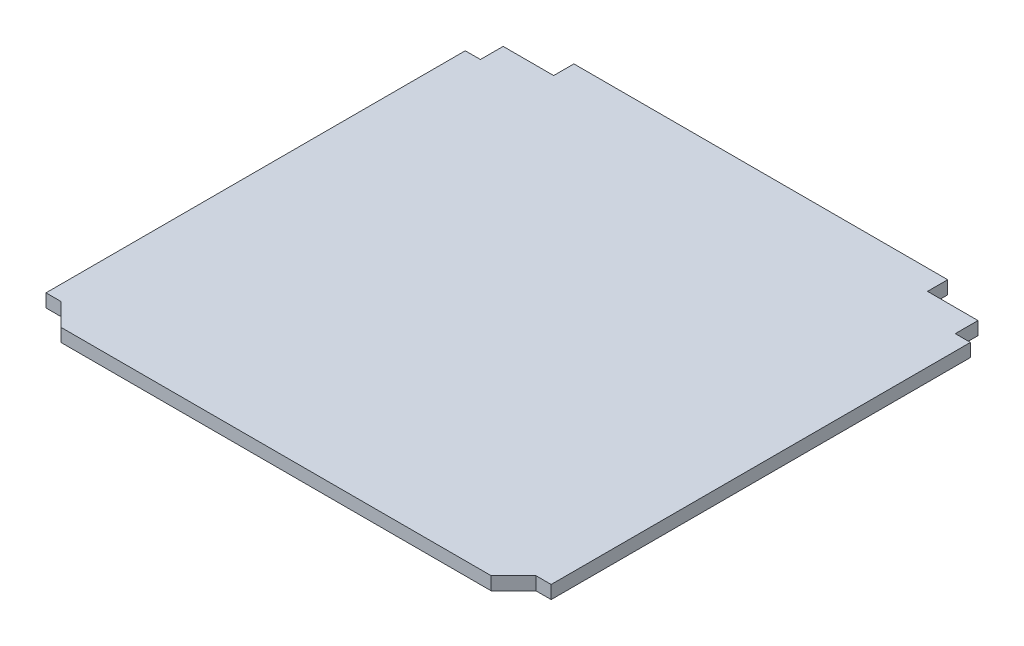
ISO-10303-21;
HEADER;
FILE_DESCRIPTION(('STEP AP214'),'2;1');
FILE_NAME('part.step','',(''),(''),'','','');
FILE_SCHEMA(('AUTOMOTIVE_DESIGN { 1 0 10303 214 1 1 1 1 }'));
ENDSEC;
DATA;
#1=APPLICATION_CONTEXT('core data for automotive mechanical design processes');
#2=APPLICATION_PROTOCOL_DEFINITION('international standard','automotive_design',2000,#1);
#3=PRODUCT_CONTEXT('',#1,'mechanical');
#4=PRODUCT('Part','Part','',(#3));
#5=PRODUCT_RELATED_PRODUCT_CATEGORY('part','',(#4));
#6=PRODUCT_DEFINITION_FORMATION('','',#4);
#7=PRODUCT_DEFINITION_CONTEXT('part definition',#1,'design');
#8=PRODUCT_DEFINITION('design','',#6,#7);
#9=PRODUCT_DEFINITION_SHAPE('','',#8);
#10=(LENGTH_UNIT() NAMED_UNIT(*) SI_UNIT(.MILLI.,.METRE.));
#11=(NAMED_UNIT(*) PLANE_ANGLE_UNIT() SI_UNIT($,.RADIAN.));
#12=(NAMED_UNIT(*) SI_UNIT($,.STERADIAN.) SOLID_ANGLE_UNIT());
#13=UNCERTAINTY_MEASURE_WITH_UNIT(LENGTH_MEASURE(1.E-05),#10,'distance_accuracy_value','');
#14=(GEOMETRIC_REPRESENTATION_CONTEXT(3) GLOBAL_UNCERTAINTY_ASSIGNED_CONTEXT((#13)) GLOBAL_UNIT_ASSIGNED_CONTEXT((#10,
#11,#12)) REPRESENTATION_CONTEXT('',''));
#15=CARTESIAN_POINT('',(0.,0.,0.));
#16=DIRECTION('',(0.,0.,1.));
#17=DIRECTION('',(1.,0.,0.));
#18=AXIS2_PLACEMENT_3D('',#15,#16,#17);
#19=CARTESIAN_POINT('',(32.8391686311288,2.6,37.));
#20=DIRECTION('',(0.,1.,0.));
#21=DIRECTION('',(-1.,0.,0.));
#22=AXIS2_PLACEMENT_3D('',#19,#20,#21);
#23=PLANE('',#22);
#24=DIRECTION('',(-0.707106781186536,0.,-0.707106781186559));
#25=VECTOR('',#24,1.);
#26=CARTESIAN_POINT('',(-44.2500000000006,2.59999999999996,44.2499999999993));
#27=LINE('',#26,#25);
#28=CARTESIAN_POINT('',(-42.5688680687594,2.59999999999998,45.9311319312405));
#29=VERTEX_POINT('',#28);
#30=CARTESIAN_POINT('',(-46.9999999999998,2.59999999999998,41.5));
#31=VERTEX_POINT('',#30);
#32=EDGE_CURVE('E43',#29,#31,#27,.T.);
#33=ORIENTED_EDGE('',*,*,#32,.F.);
#34=DIRECTION('',(1.,0.,0.));
#35=VECTOR('',#34,1.);
#36=CARTESIAN_POINT('',(0.,2.59999999999999,45.9311319312405));
#37=LINE('',#36,#35);
#38=CARTESIAN_POINT('',(42.5688680687594,2.59999999999999,45.9311319312405));
#39=VERTEX_POINT('',#38);
#40=EDGE_CURVE('E218',#29,#39,#37,.T.);
#41=ORIENTED_EDGE('',*,*,#40,.T.);
#42=DIRECTION('',(0.707106781186536,0.,-0.707106781186559));
#43=VECTOR('',#42,1.);
#44=CARTESIAN_POINT('',(44.2500000000007,2.59999999999999,44.2499999999992));
#45=LINE('',#44,#43);
#46=CARTESIAN_POINT('',(46.9999999999998,2.6,41.5));
#47=VERTEX_POINT('',#46);
#48=EDGE_CURVE('E220',#39,#47,#45,.T.);
#49=ORIENTED_EDGE('',*,*,#48,.T.);
#50=DIRECTION('',(1.,0.,0.));
#51=VECTOR('',#50,1.);
#52=CARTESIAN_POINT('',(0.,2.59999999999999,41.5));
#53=LINE('',#52,#51);
#54=CARTESIAN_POINT('',(49.9999999999998,2.59999999999999,41.5));
#55=VERTEX_POINT('',#54);
#56=EDGE_CURVE('E222',#47,#55,#53,.T.);
#57=ORIENTED_EDGE('',*,*,#56,.T.);
#58=DIRECTION('',(0.,0.,1.));
#59=VECTOR('',#58,1.);
#60=CARTESIAN_POINT('',(49.9999999999998,2.59999999999999,0.));
#61=LINE('',#60,#59);
#62=CARTESIAN_POINT('',(49.9999999999998,2.6,-41.5000000000004));
#63=VERTEX_POINT('',#62);
#64=EDGE_CURVE('E225',#63,#55,#61,.T.);
#65=ORIENTED_EDGE('',*,*,#64,.F.);
#66=DIRECTION('',(1.,0.,0.));
#67=VECTOR('',#66,1.);
#68=CARTESIAN_POINT('',(0.,2.59999999999999,-41.5000000000004));
#69=LINE('',#68,#67);
#70=CARTESIAN_POINT('',(47.0000000000006,2.59999999999999,-41.5000000000004));
#71=VERTEX_POINT('',#70);
#72=EDGE_CURVE('E230',#71,#63,#69,.T.);
#73=ORIENTED_EDGE('',*,*,#72,.F.);
#74=DIRECTION('',(0.,0.,1.));
#75=VECTOR('',#74,1.);
#76=CARTESIAN_POINT('',(47.0000000000006,2.59999999999999,0.));
#77=LINE('',#76,#75);
#78=CARTESIAN_POINT('',(47.0000000000006,2.6,-46.0000000000004));
#79=VERTEX_POINT('',#78);
#80=EDGE_CURVE('E234',#79,#71,#77,.T.);
#81=ORIENTED_EDGE('',*,*,#80,.F.);
#82=DIRECTION('',(1.,0.,0.));
#83=VECTOR('',#82,1.);
#84=CARTESIAN_POINT('',(0.,2.59999999999999,-46.0000000000004));
#85=LINE('',#84,#83);
#86=CARTESIAN_POINT('',(37.0000000000006,2.59999999999999,-46.0000000000004));
#87=VERTEX_POINT('',#86);
#88=EDGE_CURVE('E238',#87,#79,#85,.T.);
#89=ORIENTED_EDGE('',*,*,#88,.F.);
#90=DIRECTION('',(0.,0.,1.));
#91=VECTOR('',#90,1.);
#92=CARTESIAN_POINT('',(37.0000000000006,2.59999999999999,0.));
#93=LINE('',#92,#91);
#94=CARTESIAN_POINT('',(37.0000000000006,2.6,-50.0000000000004));
#95=VERTEX_POINT('',#94);
#96=EDGE_CURVE('E196',#95,#87,#93,.T.);
#97=ORIENTED_EDGE('',*,*,#96,.F.);
#98=DIRECTION('',(-1.,0.,0.));
#99=VECTOR('',#98,1.);
#100=CARTESIAN_POINT('',(0.,2.59999999999999,-50.0000000000004));
#101=LINE('',#100,#99);
#102=CARTESIAN_POINT('',(-37.0000000000006,2.59999999999999,-50.0000000000004));
#103=VERTEX_POINT('',#102);
#104=EDGE_CURVE('E224',#95,#103,#101,.T.);
#105=ORIENTED_EDGE('',*,*,#104,.T.);
#106=DIRECTION('',(0.,0.,1.));
#107=VECTOR('',#106,1.);
#108=CARTESIAN_POINT('',(-37.0000000000006,2.59999999999999,0.));
#109=LINE('',#108,#107);
#110=CARTESIAN_POINT('',(-37.0000000000006,2.59999999999998,-46.0000000000004));
#111=VERTEX_POINT('',#110);
#112=EDGE_CURVE('E245',#103,#111,#109,.T.);
#113=ORIENTED_EDGE('',*,*,#112,.T.);
#114=DIRECTION('',(-1.,0.,0.));
#115=VECTOR('',#114,1.);
#116=CARTESIAN_POINT('',(0.,2.59999999999999,-46.0000000000004));
#117=LINE('',#116,#115);
#118=CARTESIAN_POINT('',(-47.0000000000006,2.59999999999996,-46.0000000000004));
#119=VERTEX_POINT('',#118);
#120=EDGE_CURVE('E247',#111,#119,#117,.T.);
#121=ORIENTED_EDGE('',*,*,#120,.T.);
#122=DIRECTION('',(0.,0.,1.));
#123=VECTOR('',#122,1.);
#124=CARTESIAN_POINT('',(-47.0000000000006,2.59999999999996,0.));
#125=LINE('',#124,#123);
#126=CARTESIAN_POINT('',(-47.0000000000006,2.59999999999998,-41.5000000000004));
#127=VERTEX_POINT('',#126);
#128=EDGE_CURVE('E249',#119,#127,#125,.T.);
#129=ORIENTED_EDGE('',*,*,#128,.T.);
#130=DIRECTION('',(-1.,0.,0.));
#131=VECTOR('',#130,1.);
#132=CARTESIAN_POINT('',(0.,2.59999999999999,-41.5000000000004));
#133=LINE('',#132,#131);
#134=CARTESIAN_POINT('',(-49.9999999999997,2.59999999999996,-41.5000000000004));
#135=VERTEX_POINT('',#134);
#136=EDGE_CURVE('E141',#127,#135,#133,.T.);
#137=ORIENTED_EDGE('',*,*,#136,.T.);
#138=DIRECTION('',(0.,0.,1.));
#139=VECTOR('',#138,1.);
#140=CARTESIAN_POINT('',(-49.9999999999997,2.59999999999996,0.));
#141=LINE('',#140,#139);
#142=CARTESIAN_POINT('',(-49.9999999999997,2.59999999999999,41.5));
#143=VERTEX_POINT('',#142);
#144=EDGE_CURVE('E145',#135,#143,#141,.T.);
#145=ORIENTED_EDGE('',*,*,#144,.T.);
#146=DIRECTION('',(-1.,0.,0.));
#147=VECTOR('',#146,1.);
#148=CARTESIAN_POINT('',(0.,2.59999999999999,41.5));
#149=LINE('',#148,#147);
#150=EDGE_CURVE('E148',#31,#143,#149,.T.);
#151=ORIENTED_EDGE('',*,*,#150,.F.);
#152=EDGE_LOOP('',(#33,#41,#49,#57,#65,#73,#81,#89,#97,#105,#113,#121,#129,#137,#145,#151));
#153=FACE_BOUND('',#152,.T.);
#154=ADVANCED_FACE('F35',(#153),#23,.T.);
#155=CARTESIAN_POINT('',(0.,0.,0.));
#156=DIRECTION('',(0.,1.,0.));
#157=DIRECTION('',(0.,0.,1.));
#158=AXIS2_PLACEMENT_3D('',#155,#156,#157);
#159=PLANE('',#158);
#160=DIRECTION('',(-0.707106781186536,0.,-0.707106781186559));
#161=VECTOR('',#160,1.);
#162=CARTESIAN_POINT('',(-44.2500000000006,0.,44.2499999999992));
#163=LINE('',#162,#161);
#164=CARTESIAN_POINT('',(-42.5688680687594,0.,45.9311319312405));
#165=VERTEX_POINT('',#164);
#166=CARTESIAN_POINT('',(-46.9999999999998,0.,41.5));
#167=VERTEX_POINT('',#166);
#168=EDGE_CURVE('E167',#165,#167,#163,.T.);
#169=ORIENTED_EDGE('',*,*,#168,.T.);
#170=DIRECTION('',(-1.,0.,0.));
#171=VECTOR('',#170,1.);
#172=CARTESIAN_POINT('',(0.,0.,41.5));
#173=LINE('',#172,#171);
#174=CARTESIAN_POINT('',(-49.9999999999997,0.,41.5));
#175=VERTEX_POINT('',#174);
#176=EDGE_CURVE('E162',#167,#175,#173,.T.);
#177=ORIENTED_EDGE('',*,*,#176,.T.);
#178=DIRECTION('',(0.,0.,1.));
#179=VECTOR('',#178,1.);
#180=CARTESIAN_POINT('',(-49.9999999999997,0.,0.));
#181=LINE('',#180,#179);
#182=CARTESIAN_POINT('',(-49.9999999999997,0.,-41.5000000000004));
#183=VERTEX_POINT('',#182);
#184=EDGE_CURVE('E174',#183,#175,#181,.T.);
#185=ORIENTED_EDGE('',*,*,#184,.F.);
#186=DIRECTION('',(-1.,0.,0.));
#187=VECTOR('',#186,1.);
#188=CARTESIAN_POINT('',(0.,0.,-41.5000000000004));
#189=LINE('',#188,#187);
#190=CARTESIAN_POINT('',(-47.0000000000006,0.,-41.5000000000004));
#191=VERTEX_POINT('',#190);
#192=EDGE_CURVE('E178',#191,#183,#189,.T.);
#193=ORIENTED_EDGE('',*,*,#192,.F.);
#194=DIRECTION('',(0.,0.,1.));
#195=VECTOR('',#194,1.);
#196=CARTESIAN_POINT('',(-47.0000000000006,0.,0.));
#197=LINE('',#196,#195);
#198=CARTESIAN_POINT('',(-47.0000000000006,0.,-46.0000000000004));
#199=VERTEX_POINT('',#198);
#200=EDGE_CURVE('E182',#199,#191,#197,.T.);
#201=ORIENTED_EDGE('',*,*,#200,.F.);
#202=DIRECTION('',(-1.,0.,0.));
#203=VECTOR('',#202,1.);
#204=CARTESIAN_POINT('',(0.,0.,-46.0000000000004));
#205=LINE('',#204,#203);
#206=CARTESIAN_POINT('',(-37.0000000000006,0.,-46.0000000000004));
#207=VERTEX_POINT('',#206);
#208=EDGE_CURVE('E186',#207,#199,#205,.T.);
#209=ORIENTED_EDGE('',*,*,#208,.F.);
#210=DIRECTION('',(0.,0.,1.));
#211=VECTOR('',#210,1.);
#212=CARTESIAN_POINT('',(-37.0000000000006,0.,0.));
#213=LINE('',#212,#211);
#214=CARTESIAN_POINT('',(-37.0000000000006,0.,-50.0000000000004));
#215=VERTEX_POINT('',#214);
#216=EDGE_CURVE('E190',#215,#207,#213,.T.);
#217=ORIENTED_EDGE('',*,*,#216,.F.);
#218=DIRECTION('',(-1.,0.,0.));
#219=VECTOR('',#218,1.);
#220=CARTESIAN_POINT('',(0.,0.,-50.0000000000004));
#221=LINE('',#220,#219);
#222=CARTESIAN_POINT('',(37.0000000000006,0.,-50.0000000000004));
#223=VERTEX_POINT('',#222);
#224=EDGE_CURVE('E194',#223,#215,#221,.T.);
#225=ORIENTED_EDGE('',*,*,#224,.F.);
#226=DIRECTION('',(0.,0.,1.));
#227=VECTOR('',#226,1.);
#228=CARTESIAN_POINT('',(37.0000000000006,0.,0.));
#229=LINE('',#228,#227);
#230=CARTESIAN_POINT('',(37.0000000000006,0.,-46.0000000000004));
#231=VERTEX_POINT('',#230);
#232=EDGE_CURVE('E166',#223,#231,#229,.T.);
#233=ORIENTED_EDGE('',*,*,#232,.T.);
#234=DIRECTION('',(1.,0.,0.));
#235=VECTOR('',#234,1.);
#236=CARTESIAN_POINT('',(0.,0.,-46.0000000000004));
#237=LINE('',#236,#235);
#238=CARTESIAN_POINT('',(47.0000000000006,0.,-46.0000000000004));
#239=VERTEX_POINT('',#238);
#240=EDGE_CURVE('E170',#231,#239,#237,.T.);
#241=ORIENTED_EDGE('',*,*,#240,.T.);
#242=DIRECTION('',(0.,0.,1.));
#243=VECTOR('',#242,1.);
#244=CARTESIAN_POINT('',(47.0000000000006,0.,0.));
#245=LINE('',#244,#243);
#246=CARTESIAN_POINT('',(47.0000000000006,0.,-41.5000000000004));
#247=VERTEX_POINT('',#246);
#248=EDGE_CURVE('E200',#239,#247,#245,.T.);
#249=ORIENTED_EDGE('',*,*,#248,.T.);
#250=DIRECTION('',(1.,0.,0.));
#251=VECTOR('',#250,1.);
#252=CARTESIAN_POINT('',(0.,0.,-41.5000000000004));
#253=LINE('',#252,#251);
#254=CARTESIAN_POINT('',(49.9999999999998,0.,-41.5000000000004));
#255=VERTEX_POINT('',#254);
#256=EDGE_CURVE('E203',#247,#255,#253,.T.);
#257=ORIENTED_EDGE('',*,*,#256,.T.);
#258=DIRECTION('',(0.,0.,1.));
#259=VECTOR('',#258,1.);
#260=CARTESIAN_POINT('',(49.9999999999998,0.,0.));
#261=LINE('',#260,#259);
#262=CARTESIAN_POINT('',(49.9999999999998,0.,41.5));
#263=VERTEX_POINT('',#262);
#264=EDGE_CURVE('E152',#255,#263,#261,.T.);
#265=ORIENTED_EDGE('',*,*,#264,.T.);
#266=DIRECTION('',(1.,0.,0.));
#267=VECTOR('',#266,1.);
#268=CARTESIAN_POINT('',(0.,0.,41.5));
#269=LINE('',#268,#267);
#270=CARTESIAN_POINT('',(46.9999999999998,0.,41.5));
#271=VERTEX_POINT('',#270);
#272=EDGE_CURVE('E208',#271,#263,#269,.T.);
#273=ORIENTED_EDGE('',*,*,#272,.F.);
#274=DIRECTION('',(0.707106781186536,0.,-0.707106781186559));
#275=VECTOR('',#274,1.);
#276=CARTESIAN_POINT('',(44.2500000000006,0.,44.2499999999992));
#277=LINE('',#276,#275);
#278=CARTESIAN_POINT('',(42.5688680687594,0.,45.9311319312405));
#279=VERTEX_POINT('',#278);
#280=EDGE_CURVE('E213',#279,#271,#277,.T.);
#281=ORIENTED_EDGE('',*,*,#280,.F.);
#282=DIRECTION('',(1.,0.,0.));
#283=VECTOR('',#282,1.);
#284=CARTESIAN_POINT('',(0.,0.,45.9311319312405));
#285=LINE('',#284,#283);
#286=EDGE_CURVE('E157',#165,#279,#285,.T.);
#287=ORIENTED_EDGE('',*,*,#286,.F.);
#288=EDGE_LOOP('',(#169,#177,#185,#193,#201,#209,#217,#225,#233,#241,#249,#257,#265,#273,#281,#287));
#289=FACE_BOUND('',#288,.T.);
#290=ADVANCED_FACE('F273',(#289),#159,.F.);
#291=CARTESIAN_POINT('',(0.,141.174103185296,41.5));
#292=DIRECTION('',(0.,0.,1.));
#293=DIRECTION('',(1.,0.,0.));
#294=AXIS2_PLACEMENT_3D('',#291,#292,#293);
#295=PLANE('',#294);
#296=DIRECTION('',(0.,-1.,0.));
#297=VECTOR('',#296,1.);
#298=CARTESIAN_POINT('',(-46.9999999999998,141.174103185296,41.5));
#299=LINE('',#298,#297);
#300=EDGE_CURVE('E11',#31,#167,#299,.T.);
#301=ORIENTED_EDGE('',*,*,#300,.F.);
#302=ORIENTED_EDGE('',*,*,#150,.T.);
#303=DIRECTION('',(0.,-1.,0.));
#304=VECTOR('',#303,1.);
#305=CARTESIAN_POINT('',(-49.9999999999997,141.174103185296,41.5));
#306=LINE('',#305,#304);
#307=EDGE_CURVE('E151',#143,#175,#306,.T.);
#308=ORIENTED_EDGE('',*,*,#307,.T.);
#309=ORIENTED_EDGE('',*,*,#176,.F.);
#310=EDGE_LOOP('',(#301,#302,#308,#309));
#311=FACE_BOUND('',#310,.T.);
#312=ADVANCED_FACE('F160',(#311),#295,.T.);
#313=CARTESIAN_POINT('',(-49.9999999999997,141.174103185296,0.));
#314=DIRECTION('',(1.,0.,0.));
#315=DIRECTION('',(0.,0.,-1.));
#316=AXIS2_PLACEMENT_3D('',#313,#314,#315);
#317=PLANE('',#316);
#318=ORIENTED_EDGE('',*,*,#144,.F.);
#319=DIRECTION('',(0.,-1.,0.));
#320=VECTOR('',#319,1.);
#321=CARTESIAN_POINT('',(-49.9999999999997,141.174103185296,-41.5000000000004));
#322=LINE('',#321,#320);
#323=EDGE_CURVE('E177',#135,#183,#322,.T.);
#324=ORIENTED_EDGE('',*,*,#323,.T.);
#325=ORIENTED_EDGE('',*,*,#184,.T.);
#326=ORIENTED_EDGE('',*,*,#307,.F.);
#327=EDGE_LOOP('',(#318,#324,#325,#326));
#328=FACE_BOUND('',#327,.T.);
#329=ADVANCED_FACE('F267',(#328),#317,.F.);
#330=CARTESIAN_POINT('',(0.,141.174103185296,-41.5000000000004));
#331=DIRECTION('',(0.,0.,1.));
#332=DIRECTION('',(1.,0.,0.));
#333=AXIS2_PLACEMENT_3D('',#330,#331,#332);
#334=PLANE('',#333);
#335=ORIENTED_EDGE('',*,*,#136,.F.);
#336=DIRECTION('',(0.,-1.,0.));
#337=VECTOR('',#336,1.);
#338=CARTESIAN_POINT('',(-47.0000000000006,141.174103185296,-41.5000000000004));
#339=LINE('',#338,#337);
#340=EDGE_CURVE('E176',#127,#191,#339,.T.);
#341=ORIENTED_EDGE('',*,*,#340,.T.);
#342=ORIENTED_EDGE('',*,*,#192,.T.);
#343=ORIENTED_EDGE('',*,*,#323,.F.);
#344=EDGE_LOOP('',(#335,#341,#342,#343));
#345=FACE_BOUND('',#344,.T.);
#346=ADVANCED_FACE('F270',(#345),#334,.F.);
#347=CARTESIAN_POINT('',(-47.0000000000006,141.174103185296,0.));
#348=DIRECTION('',(1.,0.,0.));
#349=DIRECTION('',(0.,0.,-1.));
#350=AXIS2_PLACEMENT_3D('',#347,#348,#349);
#351=PLANE('',#350);
#352=ORIENTED_EDGE('',*,*,#128,.F.);
#353=DIRECTION('',(0.,-1.,0.));
#354=VECTOR('',#353,1.);
#355=CARTESIAN_POINT('',(-47.0000000000006,141.174103185296,-46.0000000000004));
#356=LINE('',#355,#354);
#357=EDGE_CURVE('E181',#119,#199,#356,.T.);
#358=ORIENTED_EDGE('',*,*,#357,.T.);
#359=ORIENTED_EDGE('',*,*,#200,.T.);
#360=ORIENTED_EDGE('',*,*,#340,.F.);
#361=EDGE_LOOP('',(#352,#358,#359,#360));
#362=FACE_BOUND('',#361,.T.);
#363=ADVANCED_FACE('F327',(#362),#351,.F.);
#364=CARTESIAN_POINT('',(0.,141.174103185296,-46.0000000000004));
#365=DIRECTION('',(0.,0.,1.));
#366=DIRECTION('',(1.,0.,0.));
#367=AXIS2_PLACEMENT_3D('',#364,#365,#366);
#368=PLANE('',#367);
#369=ORIENTED_EDGE('',*,*,#120,.F.);
#370=DIRECTION('',(0.,-1.,0.));
#371=VECTOR('',#370,1.);
#372=CARTESIAN_POINT('',(-37.0000000000006,141.174103185296,-46.0000000000004));
#373=LINE('',#372,#371);
#374=EDGE_CURVE('E185',#111,#207,#373,.T.);
#375=ORIENTED_EDGE('',*,*,#374,.T.);
#376=ORIENTED_EDGE('',*,*,#208,.T.);
#377=ORIENTED_EDGE('',*,*,#357,.F.);
#378=EDGE_LOOP('',(#369,#375,#376,#377));
#379=FACE_BOUND('',#378,.T.);
#380=ADVANCED_FACE('F323',(#379),#368,.F.);
#381=CARTESIAN_POINT('',(-37.0000000000006,141.174103185296,0.));
#382=DIRECTION('',(1.,0.,0.));
#383=DIRECTION('',(0.,0.,-1.));
#384=AXIS2_PLACEMENT_3D('',#381,#382,#383);
#385=PLANE('',#384);
#386=ORIENTED_EDGE('',*,*,#112,.F.);
#387=DIRECTION('',(0.,-1.,0.));
#388=VECTOR('',#387,1.);
#389=CARTESIAN_POINT('',(-37.0000000000006,141.174103185296,-50.0000000000004));
#390=LINE('',#389,#388);
#391=EDGE_CURVE('E189',#103,#215,#390,.T.);
#392=ORIENTED_EDGE('',*,*,#391,.T.);
#393=ORIENTED_EDGE('',*,*,#216,.T.);
#394=ORIENTED_EDGE('',*,*,#374,.F.);
#395=EDGE_LOOP('',(#386,#392,#393,#394));
#396=FACE_BOUND('',#395,.T.);
#397=ADVANCED_FACE('F319',(#396),#385,.F.);
#398=CARTESIAN_POINT('',(0.,141.174103185296,-50.0000000000004));
#399=DIRECTION('',(0.,0.,1.));
#400=DIRECTION('',(1.,0.,0.));
#401=AXIS2_PLACEMENT_3D('',#398,#399,#400);
#402=PLANE('',#401);
#403=ORIENTED_EDGE('',*,*,#104,.F.);
#404=DIRECTION('',(0.,-1.,0.));
#405=VECTOR('',#404,1.);
#406=CARTESIAN_POINT('',(37.0000000000006,141.174103185296,-50.0000000000004));
#407=LINE('',#406,#405);
#408=EDGE_CURVE('E193',#95,#223,#407,.T.);
#409=ORIENTED_EDGE('',*,*,#408,.T.);
#410=ORIENTED_EDGE('',*,*,#224,.T.);
#411=ORIENTED_EDGE('',*,*,#391,.F.);
#412=EDGE_LOOP('',(#403,#409,#410,#411));
#413=FACE_BOUND('',#412,.T.);
#414=ADVANCED_FACE('F315',(#413),#402,.F.);
#415=CARTESIAN_POINT('',(37.0000000000006,141.174103185296,0.));
#416=DIRECTION('',(1.,0.,0.));
#417=DIRECTION('',(0.,0.,-1.));
#418=AXIS2_PLACEMENT_3D('',#415,#416,#417);
#419=PLANE('',#418);
#420=ORIENTED_EDGE('',*,*,#408,.F.);
#421=ORIENTED_EDGE('',*,*,#96,.T.);
#422=DIRECTION('',(0.,-1.,0.));
#423=VECTOR('',#422,1.);
#424=CARTESIAN_POINT('',(37.0000000000006,141.174103185296,-46.0000000000004));
#425=LINE('',#424,#423);
#426=EDGE_CURVE('E241',#87,#231,#425,.T.);
#427=ORIENTED_EDGE('',*,*,#426,.T.);
#428=ORIENTED_EDGE('',*,*,#232,.F.);
#429=EDGE_LOOP('',(#420,#421,#427,#428));
#430=FACE_BOUND('',#429,.T.);
#431=ADVANCED_FACE('F311',(#430),#419,.T.);
#432=CARTESIAN_POINT('',(0.,141.174103185296,-46.0000000000004));
#433=DIRECTION('',(0.,0.,-1.));
#434=DIRECTION('',(-1.,0.,0.));
#435=AXIS2_PLACEMENT_3D('',#432,#433,#434);
#436=PLANE('',#435);
#437=ORIENTED_EDGE('',*,*,#426,.F.);
#438=ORIENTED_EDGE('',*,*,#88,.T.);
#439=DIRECTION('',(0.,-1.,0.));
#440=VECTOR('',#439,1.);
#441=CARTESIAN_POINT('',(47.0000000000006,141.174103185296,-46.0000000000004));
#442=LINE('',#441,#440);
#443=EDGE_CURVE('E237',#79,#239,#442,.T.);
#444=ORIENTED_EDGE('',*,*,#443,.T.);
#445=ORIENTED_EDGE('',*,*,#240,.F.);
#446=EDGE_LOOP('',(#437,#438,#444,#445));
#447=FACE_BOUND('',#446,.T.);
#448=ADVANCED_FACE('F307',(#447),#436,.T.);
#449=CARTESIAN_POINT('',(47.0000000000006,141.174103185296,0.));
#450=DIRECTION('',(1.,0.,0.));
#451=DIRECTION('',(0.,0.,-1.));
#452=AXIS2_PLACEMENT_3D('',#449,#450,#451);
#453=PLANE('',#452);
#454=ORIENTED_EDGE('',*,*,#443,.F.);
#455=ORIENTED_EDGE('',*,*,#80,.T.);
#456=DIRECTION('',(0.,-1.,0.));
#457=VECTOR('',#456,1.);
#458=CARTESIAN_POINT('',(47.0000000000006,141.174103185296,-41.5000000000004));
#459=LINE('',#458,#457);
#460=EDGE_CURVE('E233',#71,#247,#459,.T.);
#461=ORIENTED_EDGE('',*,*,#460,.T.);
#462=ORIENTED_EDGE('',*,*,#248,.F.);
#463=EDGE_LOOP('',(#454,#455,#461,#462));
#464=FACE_BOUND('',#463,.T.);
#465=ADVANCED_FACE('F303',(#464),#453,.T.);
#466=CARTESIAN_POINT('',(0.,141.174103185296,-41.5000000000004));
#467=DIRECTION('',(0.,0.,-1.));
#468=DIRECTION('',(-1.,0.,0.));
#469=AXIS2_PLACEMENT_3D('',#466,#467,#468);
#470=PLANE('',#469);
#471=ORIENTED_EDGE('',*,*,#460,.F.);
#472=ORIENTED_EDGE('',*,*,#72,.T.);
#473=DIRECTION('',(0.,-1.,0.));
#474=VECTOR('',#473,1.);
#475=CARTESIAN_POINT('',(49.9999999999998,141.174103185296,-41.5000000000004));
#476=LINE('',#475,#474);
#477=EDGE_CURVE('E229',#63,#255,#476,.T.);
#478=ORIENTED_EDGE('',*,*,#477,.T.);
#479=ORIENTED_EDGE('',*,*,#256,.F.);
#480=EDGE_LOOP('',(#471,#472,#478,#479));
#481=FACE_BOUND('',#480,.T.);
#482=ADVANCED_FACE('F299',(#481),#470,.T.);
#483=CARTESIAN_POINT('',(49.9999999999998,141.174103185296,0.));
#484=DIRECTION('',(1.,0.,0.));
#485=DIRECTION('',(0.,0.,-1.));
#486=AXIS2_PLACEMENT_3D('',#483,#484,#485);
#487=PLANE('',#486);
#488=ORIENTED_EDGE('',*,*,#477,.F.);
#489=ORIENTED_EDGE('',*,*,#64,.T.);
#490=DIRECTION('',(0.,-1.,0.));
#491=VECTOR('',#490,1.);
#492=CARTESIAN_POINT('',(49.9999999999998,141.174103185296,41.5));
#493=LINE('',#492,#491);
#494=EDGE_CURVE('E228',#55,#263,#493,.T.);
#495=ORIENTED_EDGE('',*,*,#494,.T.);
#496=ORIENTED_EDGE('',*,*,#264,.F.);
#497=EDGE_LOOP('',(#488,#489,#495,#496));
#498=FACE_BOUND('',#497,.T.);
#499=ADVANCED_FACE('F295',(#498),#487,.T.);
#500=CARTESIAN_POINT('',(0.,141.174103185296,41.5));
#501=DIRECTION('',(0.,0.,-1.));
#502=DIRECTION('',(-1.,0.,0.));
#503=AXIS2_PLACEMENT_3D('',#500,#501,#502);
#504=PLANE('',#503);
#505=ORIENTED_EDGE('',*,*,#56,.F.);
#506=DIRECTION('',(0.,-1.,0.));
#507=VECTOR('',#506,1.);
#508=CARTESIAN_POINT('',(46.9999999999998,141.174103185296,41.5));
#509=LINE('',#508,#507);
#510=EDGE_CURVE('E212',#47,#271,#509,.T.);
#511=ORIENTED_EDGE('',*,*,#510,.T.);
#512=ORIENTED_EDGE('',*,*,#272,.T.);
#513=ORIENTED_EDGE('',*,*,#494,.F.);
#514=EDGE_LOOP('',(#505,#511,#512,#513));
#515=FACE_BOUND('',#514,.T.);
#516=ADVANCED_FACE('F291',(#515),#504,.F.);
#517=CARTESIAN_POINT('',(44.2500000000006,141.174103185296,44.2499999999992));
#518=DIRECTION('',(-0.707106781186559,0.,-0.707106781186536));
#519=DIRECTION('',(-0.707106781186536,0.,0.707106781186559));
#520=AXIS2_PLACEMENT_3D('',#517,#518,#519);
#521=PLANE('',#520);
#522=ORIENTED_EDGE('',*,*,#48,.F.);
#523=DIRECTION('',(0.,-1.,0.));
#524=VECTOR('',#523,1.);
#525=CARTESIAN_POINT('',(42.5688680687594,141.174103185296,45.9311319312405));
#526=LINE('',#525,#524);
#527=EDGE_CURVE('E211',#39,#279,#526,.T.);
#528=ORIENTED_EDGE('',*,*,#527,.T.);
#529=ORIENTED_EDGE('',*,*,#280,.T.);
#530=ORIENTED_EDGE('',*,*,#510,.F.);
#531=EDGE_LOOP('',(#522,#528,#529,#530));
#532=FACE_BOUND('',#531,.T.);
#533=ADVANCED_FACE('F287',(#532),#521,.F.);
#534=CARTESIAN_POINT('',(0.,141.174103185296,45.9311319312405));
#535=DIRECTION('',(0.,0.,-1.));
#536=DIRECTION('',(-1.,0.,0.));
#537=AXIS2_PLACEMENT_3D('',#534,#535,#536);
#538=PLANE('',#537);
#539=ORIENTED_EDGE('',*,*,#40,.F.);
#540=DIRECTION('',(0.,-1.,0.));
#541=VECTOR('',#540,1.);
#542=CARTESIAN_POINT('',(-42.5688680687594,141.174103185296,45.9311319312405));
#543=LINE('',#542,#541);
#544=EDGE_CURVE('E155',#29,#165,#543,.T.);
#545=ORIENTED_EDGE('',*,*,#544,.T.);
#546=ORIENTED_EDGE('',*,*,#286,.T.);
#547=ORIENTED_EDGE('',*,*,#527,.F.);
#548=EDGE_LOOP('',(#539,#545,#546,#547));
#549=FACE_BOUND('',#548,.T.);
#550=ADVANCED_FACE('F284',(#549),#538,.F.);
#551=CARTESIAN_POINT('',(-44.2500000000006,141.174103185296,44.2499999999992));
#552=DIRECTION('',(-0.707106781186559,0.,0.707106781186536));
#553=DIRECTION('',(0.707106781186536,0.,0.707106781186559));
#554=AXIS2_PLACEMENT_3D('',#551,#552,#553);
#555=PLANE('',#554);
#556=ORIENTED_EDGE('',*,*,#544,.F.);
#557=ORIENTED_EDGE('',*,*,#32,.T.);
#558=ORIENTED_EDGE('',*,*,#300,.T.);
#559=ORIENTED_EDGE('',*,*,#168,.F.);
#560=EDGE_LOOP('',(#556,#557,#558,#559));
#561=FACE_BOUND('',#560,.T.);
#562=ADVANCED_FACE('F154',(#561),#555,.T.);
#563=CLOSED_SHELL('',(#154,#290,#312,#329,#346,#363,#380,#397,#414,#431,#448,#465,#482,#499,
#516,#533,#550,#562));
#564=MANIFOLD_SOLID_BREP('B2',#563);
#565=ADVANCED_BREP_SHAPE_REPRESENTATION('',(#18,#564),#14);
#566=SHAPE_DEFINITION_REPRESENTATION(#9,#565);
ENDSEC;
END-ISO-10303-21;
